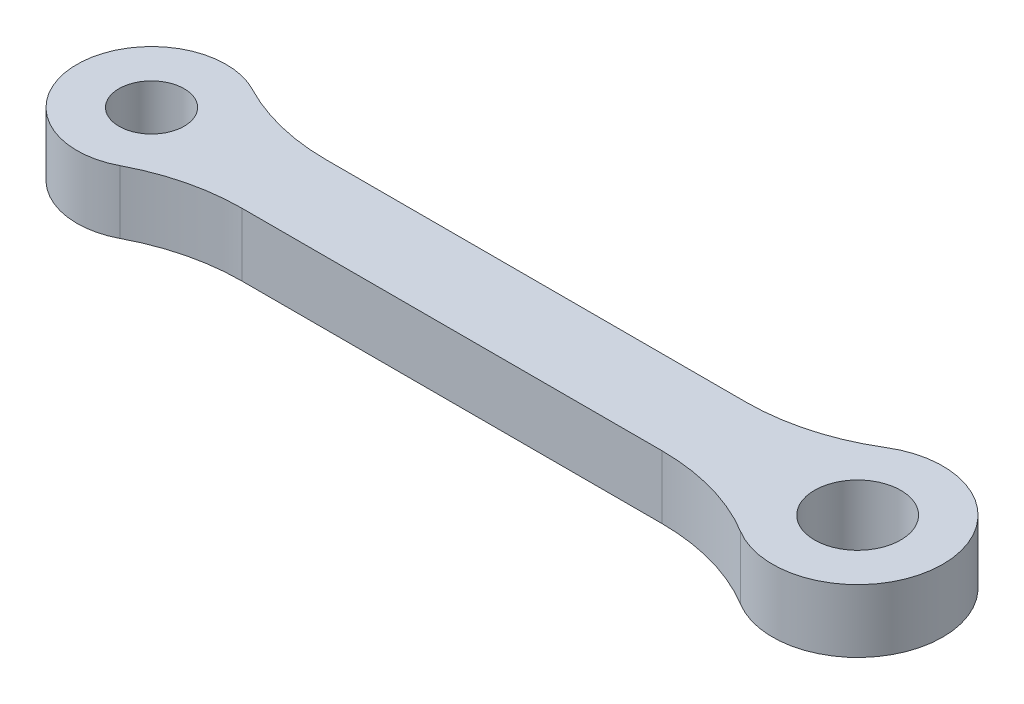
ISO-10303-21;
HEADER;
FILE_DESCRIPTION(('STEP AP214'),'2;1');
FILE_NAME('part.step','',(''),(''),'','','');
FILE_SCHEMA(('AUTOMOTIVE_DESIGN { 1 0 10303 214 1 1 1 1 }'));
ENDSEC;
DATA;
#1=APPLICATION_CONTEXT('core data for automotive mechanical design processes');
#2=APPLICATION_PROTOCOL_DEFINITION('international standard','automotive_design',2000,#1);
#3=PRODUCT_CONTEXT('',#1,'mechanical');
#4=PRODUCT('Part','Part','',(#3));
#5=PRODUCT_RELATED_PRODUCT_CATEGORY('part','',(#4));
#6=PRODUCT_DEFINITION_FORMATION('','',#4);
#7=PRODUCT_DEFINITION_CONTEXT('part definition',#1,'design');
#8=PRODUCT_DEFINITION('design','',#6,#7);
#9=PRODUCT_DEFINITION_SHAPE('','',#8);
#10=(LENGTH_UNIT() NAMED_UNIT(*) SI_UNIT(.MILLI.,.METRE.));
#11=(NAMED_UNIT(*) PLANE_ANGLE_UNIT() SI_UNIT($,.RADIAN.));
#12=(NAMED_UNIT(*) SI_UNIT($,.STERADIAN.) SOLID_ANGLE_UNIT());
#13=UNCERTAINTY_MEASURE_WITH_UNIT(LENGTH_MEASURE(1.E-05),#10,'distance_accuracy_value','');
#14=(GEOMETRIC_REPRESENTATION_CONTEXT(3) GLOBAL_UNCERTAINTY_ASSIGNED_CONTEXT((#13)) GLOBAL_UNIT_ASSIGNED_CONTEXT((#10,
#11,#12)) REPRESENTATION_CONTEXT('',''));
#15=CARTESIAN_POINT('',(0.,0.,0.));
#16=DIRECTION('',(0.,0.,1.));
#17=DIRECTION('',(1.,0.,0.));
#18=AXIS2_PLACEMENT_3D('',#15,#16,#17);
#19=CARTESIAN_POINT('',(0.,3.,0.));
#20=DIRECTION('',(0.,-1.,0.));
#21=DIRECTION('',(0.,0.,-1.));
#22=AXIS2_PLACEMENT_3D('',#19,#20,#21);
#23=CYLINDRICAL_SURFACE('',#22,4.05);
#24=CARTESIAN_POINT('',(0.,0.,0.));
#25=DIRECTION('',(0.,1.,0.));
#26=DIRECTION('',(0.,0.,1.));
#27=AXIS2_PLACEMENT_3D('',#24,#25,#26);
#28=CIRCLE('',#27,4.05);
#29=CARTESIAN_POINT('',(-2.10649044404579,0.,3.45907473309609));
#30=VERTEX_POINT('',#29);
#31=CARTESIAN_POINT('',(-2.10649044404579,0.,-3.45907473309608));
#32=VERTEX_POINT('',#31);
#33=EDGE_CURVE('E132',#30,#32,#28,.T.);
#34=ORIENTED_EDGE('',*,*,#33,.T.);
#35=DIRECTION('',(0.,-1.,0.));
#36=VECTOR('',#35,1.);
#37=CARTESIAN_POINT('',(-2.10649044404579,3.,-3.45907473309608));
#38=LINE('',#37,#36);
#39=CARTESIAN_POINT('',(-2.10649044404579,3.,-3.45907473309608));
#40=VERTEX_POINT('',#39);
#41=EDGE_CURVE('E150',#32,#40,#38,.F.);
#42=ORIENTED_EDGE('',*,*,#41,.T.);
#43=CARTESIAN_POINT('',(0.,3.,0.));
#44=DIRECTION('',(0.,1.,0.));
#45=DIRECTION('',(0.,0.,1.));
#46=AXIS2_PLACEMENT_3D('',#43,#44,#45);
#47=CIRCLE('',#46,4.05);
#48=CARTESIAN_POINT('',(-2.10649044404579,3.,3.45907473309609));
#49=VERTEX_POINT('',#48);
#50=EDGE_CURVE('E141',#49,#40,#47,.T.);
#51=ORIENTED_EDGE('',*,*,#50,.F.);
#52=DIRECTION('',(0.,-1.,0.));
#53=VECTOR('',#52,1.);
#54=CARTESIAN_POINT('',(-2.10649044404579,3.,3.45907473309609));
#55=LINE('',#54,#53);
#56=EDGE_CURVE('E147',#49,#30,#55,.T.);
#57=ORIENTED_EDGE('',*,*,#56,.T.);
#58=EDGE_LOOP('',(#34,#42,#51,#57));
#59=FACE_BOUND('',#58,.T.);
#60=ADVANCED_FACE('F36',(#59),#23,.T.);
#61=CARTESIAN_POINT('',(0.,3.,-2.));
#62=DIRECTION('',(0.,0.,1.));
#63=DIRECTION('',(1.,0.,0.));
#64=AXIS2_PLACEMENT_3D('',#61,#62,#63);
#65=PLANE('',#64);
#66=DIRECTION('',(-1.,0.,0.));
#67=VECTOR('',#66,1.);
#68=CARTESIAN_POINT('',(0.,0.,-2.));
#69=LINE('',#68,#67);
#70=CARTESIAN_POINT('',(-7.30770141699837,0.,-2.));
#71=VERTEX_POINT('',#70);
#72=CARTESIAN_POINT('',(-27.2869482760746,0.,-2.));
#73=VERTEX_POINT('',#72);
#74=EDGE_CURVE('E128',#71,#73,#69,.T.);
#75=ORIENTED_EDGE('',*,*,#74,.T.);
#76=DIRECTION('',(0.,1.,0.));
#77=VECTOR('',#76,1.);
#78=CARTESIAN_POINT('',(-27.2869482760746,3.,-2.));
#79=LINE('',#78,#77);
#80=CARTESIAN_POINT('',(-27.2869482760746,3.,-2.));
#81=VERTEX_POINT('',#80);
#82=EDGE_CURVE('E106',#73,#81,#79,.T.);
#83=ORIENTED_EDGE('',*,*,#82,.T.);
#84=DIRECTION('',(-1.,0.,0.));
#85=VECTOR('',#84,1.);
#86=CARTESIAN_POINT('',(0.,3.,-2.));
#87=LINE('',#86,#85);
#88=CARTESIAN_POINT('',(-7.30770141699837,3.,-2.));
#89=VERTEX_POINT('',#88);
#90=EDGE_CURVE('E176',#89,#81,#87,.T.);
#91=ORIENTED_EDGE('',*,*,#90,.F.);
#92=DIRECTION('',(0.,1.,0.));
#93=VECTOR('',#92,1.);
#94=CARTESIAN_POINT('',(-7.30770141699837,0.,-2.));
#95=LINE('',#94,#93);
#96=EDGE_CURVE('E120',#89,#71,#95,.F.);
#97=ORIENTED_EDGE('',*,*,#96,.T.);
#98=EDGE_LOOP('',(#75,#83,#91,#97));
#99=FACE_BOUND('',#98,.T.);
#100=ADVANCED_FACE('F196',(#99),#65,.F.);
#101=CARTESIAN_POINT('',(-33.58,3.,0.));
#102=DIRECTION('',(0.,-1.,0.));
#103=DIRECTION('',(0.,0.,-1.));
#104=AXIS2_PLACEMENT_3D('',#101,#102,#103);
#105=CYLINDRICAL_SURFACE('',#104,3.55);
#106=CARTESIAN_POINT('',(-33.58,3.,0.));
#107=DIRECTION('',(0.,1.,0.));
#108=DIRECTION('',(0.,0.,1.));
#109=AXIS2_PLACEMENT_3D('',#106,#107,#108);
#110=CIRCLE('',#109,3.55);
#111=CARTESIAN_POINT('',(-31.9312668915177,3.,-3.14391143911439));
#112=VERTEX_POINT('',#111);
#113=CARTESIAN_POINT('',(-31.9312668915177,3.,3.14391143911439));
#114=VERTEX_POINT('',#113);
#115=EDGE_CURVE('E119',#112,#114,#110,.T.);
#116=ORIENTED_EDGE('',*,*,#115,.F.);
#117=DIRECTION('',(0.,-1.,0.));
#118=VECTOR('',#117,1.);
#119=CARTESIAN_POINT('',(-31.9312668915177,3.,-3.14391143911439));
#120=LINE('',#119,#118);
#121=CARTESIAN_POINT('',(-31.9312668915177,0.,-3.14391143911439));
#122=VERTEX_POINT('',#121);
#123=EDGE_CURVE('E105',#112,#122,#120,.T.);
#124=ORIENTED_EDGE('',*,*,#123,.T.);
#125=CARTESIAN_POINT('',(-33.58,0.,0.));
#126=DIRECTION('',(0.,1.,0.));
#127=DIRECTION('',(0.,0.,1.));
#128=AXIS2_PLACEMENT_3D('',#125,#126,#127);
#129=CIRCLE('',#128,3.55);
#130=CARTESIAN_POINT('',(-31.9312668915177,0.,3.14391143911439));
#131=VERTEX_POINT('',#130);
#132=EDGE_CURVE('E117',#122,#131,#129,.T.);
#133=ORIENTED_EDGE('',*,*,#132,.T.);
#134=DIRECTION('',(0.,-1.,0.));
#135=VECTOR('',#134,1.);
#136=CARTESIAN_POINT('',(-31.9312668915177,3.,3.1439114391144));
#137=LINE('',#136,#135);
#138=EDGE_CURVE('E121',#131,#114,#137,.F.);
#139=ORIENTED_EDGE('',*,*,#138,.T.);
#140=EDGE_LOOP('',(#116,#124,#133,#139));
#141=FACE_BOUND('',#140,.T.);
#142=ADVANCED_FACE('F116',(#141),#105,.T.);
#143=CARTESIAN_POINT('',(0.,3.,0.));
#144=DIRECTION('',(0.,-1.,0.));
#145=DIRECTION('',(0.,0.,-1.));
#146=AXIS2_PLACEMENT_3D('',#143,#144,#145);
#147=CYLINDRICAL_SURFACE('',#146,2.05);
#148=CARTESIAN_POINT('',(0.,3.,0.));
#149=DIRECTION('',(0.,1.,0.));
#150=DIRECTION('',(0.,0.,1.));
#151=AXIS2_PLACEMENT_3D('',#148,#149,#150);
#152=CIRCLE('',#151,2.05);
#153=CARTESIAN_POINT('',(0.,3.,2.05));
#154=VERTEX_POINT('',#153);
#155=EDGE_CURVE('E184',#154,#154,#152,.T.);
#156=ORIENTED_EDGE('',*,*,#155,.T.);
#157=EDGE_LOOP('',(#156));
#158=FACE_BOUND('',#157,.T.);
#159=CARTESIAN_POINT('',(0.,0.,0.));
#160=DIRECTION('',(0.,1.,0.));
#161=DIRECTION('',(0.,0.,1.));
#162=AXIS2_PLACEMENT_3D('',#159,#160,#161);
#163=CIRCLE('',#162,2.05);
#164=CARTESIAN_POINT('',(0.,0.,2.05));
#165=VERTEX_POINT('',#164);
#166=EDGE_CURVE('E130',#165,#165,#163,.T.);
#167=ORIENTED_EDGE('',*,*,#166,.F.);
#168=EDGE_LOOP('',(#167));
#169=FACE_BOUND('',#168,.T.);
#170=ADVANCED_FACE('F203',(#158,#169),#147,.F.);
#171=CARTESIAN_POINT('',(0.,3.,2.));
#172=DIRECTION('',(0.,0.,1.));
#173=DIRECTION('',(1.,0.,0.));
#174=AXIS2_PLACEMENT_3D('',#171,#172,#173);
#175=PLANE('',#174);
#176=DIRECTION('',(-1.,0.,0.));
#177=VECTOR('',#176,1.);
#178=CARTESIAN_POINT('',(0.,0.,2.));
#179=LINE('',#178,#177);
#180=CARTESIAN_POINT('',(-7.30770141699837,0.,2.));
#181=VERTEX_POINT('',#180);
#182=CARTESIAN_POINT('',(-27.2869482760746,0.,2.));
#183=VERTEX_POINT('',#182);
#184=EDGE_CURVE('E127',#181,#183,#179,.T.);
#185=ORIENTED_EDGE('',*,*,#184,.F.);
#186=DIRECTION('',(0.,-1.,0.));
#187=VECTOR('',#186,1.);
#188=CARTESIAN_POINT('',(-7.30770141699837,3.,2.));
#189=LINE('',#188,#187);
#190=CARTESIAN_POINT('',(-7.30770141699837,3.,2.));
#191=VERTEX_POINT('',#190);
#192=EDGE_CURVE('E56',#181,#191,#189,.F.);
#193=ORIENTED_EDGE('',*,*,#192,.T.);
#194=DIRECTION('',(-1.,0.,0.));
#195=VECTOR('',#194,1.);
#196=CARTESIAN_POINT('',(0.,3.,2.));
#197=LINE('',#196,#195);
#198=CARTESIAN_POINT('',(-27.2869482760746,3.,2.));
#199=VERTEX_POINT('',#198);
#200=EDGE_CURVE('E170',#191,#199,#197,.T.);
#201=ORIENTED_EDGE('',*,*,#200,.T.);
#202=DIRECTION('',(0.,-1.,0.));
#203=VECTOR('',#202,1.);
#204=CARTESIAN_POINT('',(-27.2869482760746,3.,2.));
#205=LINE('',#204,#203);
#206=EDGE_CURVE('E152',#199,#183,#205,.T.);
#207=ORIENTED_EDGE('',*,*,#206,.T.);
#208=EDGE_LOOP('',(#185,#193,#201,#207));
#209=FACE_BOUND('',#208,.T.);
#210=ADVANCED_FACE('F179',(#209),#175,.T.);
#211=CARTESIAN_POINT('',(-33.58,3.,0.));
#212=DIRECTION('',(0.,-1.,0.));
#213=DIRECTION('',(0.,0.,-1.));
#214=AXIS2_PLACEMENT_3D('',#211,#212,#213);
#215=CYLINDRICAL_SURFACE('',#214,1.55);
#216=CARTESIAN_POINT('',(-33.58,3.,0.));
#217=DIRECTION('',(0.,1.,0.));
#218=DIRECTION('',(0.,0.,1.));
#219=AXIS2_PLACEMENT_3D('',#216,#217,#218);
#220=CIRCLE('',#219,1.55);
#221=CARTESIAN_POINT('',(-33.58,3.,1.55));
#222=VERTEX_POINT('',#221);
#223=EDGE_CURVE('E142',#222,#222,#220,.T.);
#224=ORIENTED_EDGE('',*,*,#223,.T.);
#225=EDGE_LOOP('',(#224));
#226=FACE_BOUND('',#225,.T.);
#227=CARTESIAN_POINT('',(-33.58,0.,0.));
#228=DIRECTION('',(0.,1.,0.));
#229=DIRECTION('',(0.,0.,1.));
#230=AXIS2_PLACEMENT_3D('',#227,#228,#229);
#231=CIRCLE('',#230,1.55);
#232=CARTESIAN_POINT('',(-33.58,0.,1.55));
#233=VERTEX_POINT('',#232);
#234=EDGE_CURVE('E138',#233,#233,#231,.T.);
#235=ORIENTED_EDGE('',*,*,#234,.F.);
#236=EDGE_LOOP('',(#235));
#237=FACE_BOUND('',#236,.T.);
#238=ADVANCED_FACE('F251',(#226,#237),#215,.F.);
#239=CARTESIAN_POINT('',(0.,3.,0.));
#240=DIRECTION('',(0.,1.,0.));
#241=DIRECTION('',(0.,0.,1.));
#242=AXIS2_PLACEMENT_3D('',#239,#240,#241);
#243=PLANE('',#242);
#244=ORIENTED_EDGE('',*,*,#200,.F.);
#245=CARTESIAN_POINT('',(-7.30770141699837,3.,12.));
#246=DIRECTION('',(0.,1.,0.));
#247=DIRECTION('',(0.,0.,1.));
#248=AXIS2_PLACEMENT_3D('',#245,#246,#247);
#249=CIRCLE('',#248,10.);
#250=EDGE_CURVE('E163',#191,#49,#249,.F.);
#251=ORIENTED_EDGE('',*,*,#250,.T.);
#252=ORIENTED_EDGE('',*,*,#50,.T.);
#253=CARTESIAN_POINT('',(-7.30770141699837,3.,-12.));
#254=DIRECTION('',(0.,1.,0.));
#255=DIRECTION('',(0.,0.,1.));
#256=AXIS2_PLACEMENT_3D('',#253,#254,#255);
#257=CIRCLE('',#256,10.);
#258=EDGE_CURVE('E159',#40,#89,#257,.F.);
#259=ORIENTED_EDGE('',*,*,#258,.T.);
#260=ORIENTED_EDGE('',*,*,#90,.T.);
#261=CARTESIAN_POINT('',(-27.2869482760746,3.,-12.));
#262=DIRECTION('',(0.,1.,0.));
#263=DIRECTION('',(0.,0.,1.));
#264=AXIS2_PLACEMENT_3D('',#261,#262,#263);
#265=CIRCLE('',#264,10.);
#266=EDGE_CURVE('E111',#81,#112,#265,.F.);
#267=ORIENTED_EDGE('',*,*,#266,.T.);
#268=ORIENTED_EDGE('',*,*,#115,.T.);
#269=CARTESIAN_POINT('',(-27.2869482760746,3.,12.));
#270=DIRECTION('',(0.,1.,0.));
#271=DIRECTION('',(0.,0.,1.));
#272=AXIS2_PLACEMENT_3D('',#269,#270,#271);
#273=CIRCLE('',#272,10.);
#274=EDGE_CURVE('E11',#114,#199,#273,.F.);
#275=ORIENTED_EDGE('',*,*,#274,.T.);
#276=EDGE_LOOP('',(#244,#251,#252,#259,#260,#267,#268,#275));
#277=FACE_BOUND('',#276,.T.);
#278=ORIENTED_EDGE('',*,*,#155,.F.);
#279=EDGE_LOOP('',(#278));
#280=FACE_BOUND('',#279,.T.);
#281=ORIENTED_EDGE('',*,*,#223,.F.);
#282=EDGE_LOOP('',(#281));
#283=FACE_BOUND('',#282,.T.);
#284=ADVANCED_FACE('F167',(#277,#280,#283),#243,.T.);
#285=CARTESIAN_POINT('',(0.,0.,0.));
#286=DIRECTION('',(0.,1.,0.));
#287=DIRECTION('',(0.,0.,1.));
#288=AXIS2_PLACEMENT_3D('',#285,#286,#287);
#289=PLANE('',#288);
#290=ORIENTED_EDGE('',*,*,#33,.F.);
#291=CARTESIAN_POINT('',(-7.30770141699837,0.,12.));
#292=DIRECTION('',(0.,1.,0.));
#293=DIRECTION('',(0.,0.,1.));
#294=AXIS2_PLACEMENT_3D('',#291,#292,#293);
#295=CIRCLE('',#294,10.);
#296=EDGE_CURVE('E161',#30,#181,#295,.T.);
#297=ORIENTED_EDGE('',*,*,#296,.T.);
#298=ORIENTED_EDGE('',*,*,#184,.T.);
#299=CARTESIAN_POINT('',(-27.2869482760746,0.,12.));
#300=DIRECTION('',(0.,1.,0.));
#301=DIRECTION('',(0.,0.,1.));
#302=AXIS2_PLACEMENT_3D('',#299,#300,#301);
#303=CIRCLE('',#302,10.);
#304=EDGE_CURVE('E44',#183,#131,#303,.T.);
#305=ORIENTED_EDGE('',*,*,#304,.T.);
#306=ORIENTED_EDGE('',*,*,#132,.F.);
#307=CARTESIAN_POINT('',(-27.2869482760746,0.,-12.));
#308=DIRECTION('',(0.,1.,0.));
#309=DIRECTION('',(0.,0.,1.));
#310=AXIS2_PLACEMENT_3D('',#307,#308,#309);
#311=CIRCLE('',#310,10.);
#312=EDGE_CURVE('E101',#122,#73,#311,.T.);
#313=ORIENTED_EDGE('',*,*,#312,.T.);
#314=ORIENTED_EDGE('',*,*,#74,.F.);
#315=CARTESIAN_POINT('',(-7.30770141699837,0.,-12.));
#316=DIRECTION('',(0.,1.,0.));
#317=DIRECTION('',(0.,0.,1.));
#318=AXIS2_PLACEMENT_3D('',#315,#316,#317);
#319=CIRCLE('',#318,10.);
#320=EDGE_CURVE('E157',#71,#32,#319,.T.);
#321=ORIENTED_EDGE('',*,*,#320,.T.);
#322=EDGE_LOOP('',(#290,#297,#298,#305,#306,#313,#314,#321));
#323=FACE_BOUND('',#322,.T.);
#324=ORIENTED_EDGE('',*,*,#166,.T.);
#325=EDGE_LOOP('',(#324));
#326=FACE_BOUND('',#325,.T.);
#327=ORIENTED_EDGE('',*,*,#234,.T.);
#328=EDGE_LOOP('',(#327));
#329=FACE_BOUND('',#328,.T.);
#330=ADVANCED_FACE('F124',(#323,#326,#329),#289,.F.);
#331=CARTESIAN_POINT('',(-27.2869482760746,3.,-12.));
#332=DIRECTION('',(0.,-1.,0.));
#333=DIRECTION('',(0.,0.,-1.));
#334=AXIS2_PLACEMENT_3D('',#331,#332,#333);
#335=CYLINDRICAL_SURFACE('',#334,10.);
#336=ORIENTED_EDGE('',*,*,#266,.F.);
#337=ORIENTED_EDGE('',*,*,#82,.F.);
#338=ORIENTED_EDGE('',*,*,#312,.F.);
#339=ORIENTED_EDGE('',*,*,#123,.F.);
#340=EDGE_LOOP('',(#336,#337,#338,#339));
#341=FACE_BOUND('',#340,.T.);
#342=ADVANCED_FACE('F104',(#341),#335,.F.);
#343=CARTESIAN_POINT('',(-7.30770141699837,3.,-12.));
#344=DIRECTION('',(0.,-1.,0.));
#345=DIRECTION('',(0.,0.,-1.));
#346=AXIS2_PLACEMENT_3D('',#343,#344,#345);
#347=CYLINDRICAL_SURFACE('',#346,10.);
#348=ORIENTED_EDGE('',*,*,#258,.F.);
#349=ORIENTED_EDGE('',*,*,#41,.F.);
#350=ORIENTED_EDGE('',*,*,#320,.F.);
#351=ORIENTED_EDGE('',*,*,#96,.F.);
#352=EDGE_LOOP('',(#348,#349,#350,#351));
#353=FACE_BOUND('',#352,.T.);
#354=ADVANCED_FACE('F192',(#353),#347,.F.);
#355=CARTESIAN_POINT('',(-7.30770141699837,3.,12.));
#356=DIRECTION('',(0.,-1.,0.));
#357=DIRECTION('',(0.,0.,-1.));
#358=AXIS2_PLACEMENT_3D('',#355,#356,#357);
#359=CYLINDRICAL_SURFACE('',#358,10.);
#360=ORIENTED_EDGE('',*,*,#250,.F.);
#361=ORIENTED_EDGE('',*,*,#192,.F.);
#362=ORIENTED_EDGE('',*,*,#296,.F.);
#363=ORIENTED_EDGE('',*,*,#56,.F.);
#364=EDGE_LOOP('',(#360,#361,#362,#363));
#365=FACE_BOUND('',#364,.T.);
#366=ADVANCED_FACE('F178',(#365),#359,.F.);
#367=CARTESIAN_POINT('',(-27.2869482760746,3.,12.));
#368=DIRECTION('',(0.,-1.,0.));
#369=DIRECTION('',(0.,0.,-1.));
#370=AXIS2_PLACEMENT_3D('',#367,#368,#369);
#371=CYLINDRICAL_SURFACE('',#370,10.);
#372=ORIENTED_EDGE('',*,*,#274,.F.);
#373=ORIENTED_EDGE('',*,*,#138,.F.);
#374=ORIENTED_EDGE('',*,*,#304,.F.);
#375=ORIENTED_EDGE('',*,*,#206,.F.);
#376=EDGE_LOOP('',(#372,#373,#374,#375));
#377=FACE_BOUND('',#376,.T.);
#378=ADVANCED_FACE('F38',(#377),#371,.F.);
#379=CLOSED_SHELL('',(#60,#100,#142,#170,#210,#238,#284,#330,#342,#354,#366,#378));
#380=MANIFOLD_SOLID_BREP('B2',#379);
#381=ADVANCED_BREP_SHAPE_REPRESENTATION('',(#18,#380),#14);
#382=SHAPE_DEFINITION_REPRESENTATION(#9,#381);
ENDSEC;
END-ISO-10303-21;
